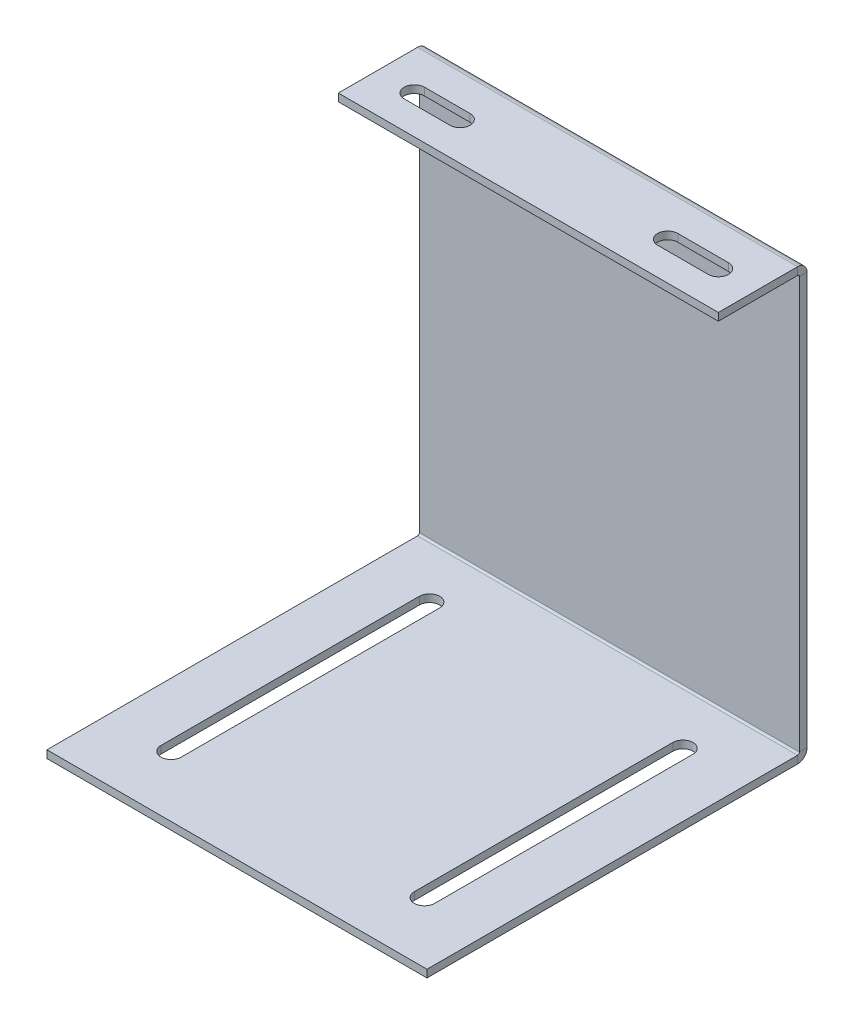
ISO-10303-21;
HEADER;
FILE_DESCRIPTION(('STEP AP214'),'2;1');
FILE_NAME('part.step','',(''),(''),'','','');
FILE_SCHEMA(('AUTOMOTIVE_DESIGN { 1 0 10303 214 1 1 1 1 }'));
ENDSEC;
DATA;
#1=APPLICATION_CONTEXT('core data for automotive mechanical design processes');
#2=APPLICATION_PROTOCOL_DEFINITION('international standard','automotive_design',2000,#1);
#3=PRODUCT_CONTEXT('',#1,'mechanical');
#4=PRODUCT('Part','Part','',(#3));
#5=PRODUCT_RELATED_PRODUCT_CATEGORY('part','',(#4));
#6=PRODUCT_DEFINITION_FORMATION('','',#4);
#7=PRODUCT_DEFINITION_CONTEXT('part definition',#1,'design');
#8=PRODUCT_DEFINITION('design','',#6,#7);
#9=PRODUCT_DEFINITION_SHAPE('','',#8);
#10=(LENGTH_UNIT() NAMED_UNIT(*) SI_UNIT(.MILLI.,.METRE.));
#11=(NAMED_UNIT(*) PLANE_ANGLE_UNIT() SI_UNIT($,.RADIAN.));
#12=(NAMED_UNIT(*) SI_UNIT($,.STERADIAN.) SOLID_ANGLE_UNIT());
#13=UNCERTAINTY_MEASURE_WITH_UNIT(LENGTH_MEASURE(1.E-05),#10,'distance_accuracy_value','');
#14=(GEOMETRIC_REPRESENTATION_CONTEXT(3) GLOBAL_UNCERTAINTY_ASSIGNED_CONTEXT((#13)) GLOBAL_UNIT_ASSIGNED_CONTEXT((#10,
#11,#12)) REPRESENTATION_CONTEXT('',''));
#15=CARTESIAN_POINT('',(0.,0.,0.));
#16=DIRECTION('',(0.,0.,1.));
#17=DIRECTION('',(1.,0.,0.));
#18=AXIS2_PLACEMENT_3D('',#15,#16,#17);
#19=CARTESIAN_POINT('',(-130.705035971223,0.,-28.9532374100719));
#20=DIRECTION('',(-1.,0.,0.));
#21=DIRECTION('',(0.,-1.,0.));
#22=AXIS2_PLACEMENT_3D('',#19,#20,#21);
#23=PLANE('',#22);
#24=DIRECTION('',(0.,1.,0.));
#25=VECTOR('',#24,1.);
#26=CARTESIAN_POINT('',(-130.705035971223,0.,-25.9532374100719));
#27=LINE('',#26,#25);
#28=CARTESIAN_POINT('',(-130.705035971223,163.2634,-25.9532374100719));
#29=VERTEX_POINT('',#28);
#30=CARTESIAN_POINT('',(-130.705035971223,0.736599999999999,-25.9532374100719));
#31=VERTEX_POINT('',#30);
#32=EDGE_CURVE('E373',#29,#31,#27,.F.);
#33=ORIENTED_EDGE('',*,*,#32,.F.);
#34=DIRECTION('',(0.,0.,-1.));
#35=VECTOR('',#34,1.);
#36=CARTESIAN_POINT('',(-130.705035971223,163.2634,-25.9532374100719));
#37=LINE('',#36,#35);
#38=CARTESIAN_POINT('',(-130.705035971223,163.2634,-28.9532374100719));
#39=VERTEX_POINT('',#38);
#40=EDGE_CURVE('E351',#29,#39,#37,.T.);
#41=ORIENTED_EDGE('',*,*,#40,.T.);
#42=DIRECTION('',(0.,-1.,0.));
#43=VECTOR('',#42,1.);
#44=CARTESIAN_POINT('',(-130.705035971223,0.,-28.9532374100719));
#45=LINE('',#44,#43);
#46=CARTESIAN_POINT('',(-130.705035971223,0.736600000000021,-28.9532374100719));
#47=VERTEX_POINT('',#46);
#48=EDGE_CURVE('E367',#39,#47,#45,.T.);
#49=ORIENTED_EDGE('',*,*,#48,.T.);
#50=DIRECTION('',(0.,0.,-1.));
#51=VECTOR('',#50,1.);
#52=CARTESIAN_POINT('',(-130.705035971223,0.7366,-25.9532374100719));
#53=LINE('',#52,#51);
#54=EDGE_CURVE('E381',#31,#47,#53,.T.);
#55=ORIENTED_EDGE('',*,*,#54,.F.);
#56=EDGE_LOOP('',(#33,#41,#49,#55));
#57=FACE_BOUND('',#56,.T.);
#58=ADVANCED_FACE('F78',(#57),#23,.T.);
#59=CARTESIAN_POINT('',(0.,0.,-28.9532374100719));
#60=DIRECTION('',(0.,0.,-1.));
#61=DIRECTION('',(-1.,0.,0.));
#62=AXIS2_PLACEMENT_3D('',#59,#60,#61);
#63=PLANE('',#62);
#64=ORIENTED_EDGE('',*,*,#48,.F.);
#65=DIRECTION('',(-1.,0.,0.));
#66=VECTOR('',#65,1.);
#67=CARTESIAN_POINT('',(-130.705035971223,163.2634,-28.9532374100719));
#68=LINE('',#67,#66);
#69=CARTESIAN_POINT('',(19.2949640287769,163.2634,-28.9532374100719));
#70=VERTEX_POINT('',#69);
#71=EDGE_CURVE('E344',#39,#70,#68,.F.);
#72=ORIENTED_EDGE('',*,*,#71,.T.);
#73=DIRECTION('',(0.,1.,0.));
#74=VECTOR('',#73,1.);
#75=CARTESIAN_POINT('',(19.2949640287769,167.,-28.9532374100719));
#76=LINE('',#75,#74);
#77=CARTESIAN_POINT('',(19.2949640287769,0.736599999999988,-28.9532374100719));
#78=VERTEX_POINT('',#77);
#79=EDGE_CURVE('E370',#78,#70,#76,.T.);
#80=ORIENTED_EDGE('',*,*,#79,.F.);
#81=DIRECTION('',(-1.,0.,0.));
#82=VECTOR('',#81,1.);
#83=CARTESIAN_POINT('',(0.,0.736600000000018,-28.9532374100719));
#84=LINE('',#83,#82);
#85=EDGE_CURVE('E378',#78,#47,#84,.T.);
#86=ORIENTED_EDGE('',*,*,#85,.T.);
#87=EDGE_LOOP('',(#64,#72,#80,#86));
#88=FACE_BOUND('',#87,.T.);
#89=ADVANCED_FACE('F532',(#88),#63,.T.);
#90=CARTESIAN_POINT('',(0.,0.,-25.9532374100719));
#91=DIRECTION('',(0.,0.,-1.));
#92=DIRECTION('',(-1.,0.,0.));
#93=AXIS2_PLACEMENT_3D('',#90,#91,#92);
#94=PLANE('',#93);
#95=DIRECTION('',(-1.,0.,0.));
#96=VECTOR('',#95,1.);
#97=CARTESIAN_POINT('',(-130.705035971223,163.2634,-25.9532374100719));
#98=LINE('',#97,#96);
#99=CARTESIAN_POINT('',(19.2949640287769,163.2634,-25.9532374100719));
#100=VERTEX_POINT('',#99);
#101=EDGE_CURVE('E357',#29,#100,#98,.F.);
#102=ORIENTED_EDGE('',*,*,#101,.F.);
#103=ORIENTED_EDGE('',*,*,#32,.T.);
#104=DIRECTION('',(1.,0.,0.));
#105=VECTOR('',#104,1.);
#106=CARTESIAN_POINT('',(19.2949640287769,0.736599999999997,-25.9532374100719));
#107=LINE('',#106,#105);
#108=CARTESIAN_POINT('',(19.2949640287769,0.736599999999988,-25.9532374100719));
#109=VERTEX_POINT('',#108);
#110=EDGE_CURVE('E384',#109,#31,#107,.F.);
#111=ORIENTED_EDGE('',*,*,#110,.F.);
#112=DIRECTION('',(0.,-1.,0.));
#113=VECTOR('',#112,1.);
#114=CARTESIAN_POINT('',(19.2949640287769,0.,-25.9532374100719));
#115=LINE('',#114,#113);
#116=EDGE_CURVE('E375',#109,#100,#115,.F.);
#117=ORIENTED_EDGE('',*,*,#116,.T.);
#118=EDGE_LOOP('',(#102,#103,#111,#117));
#119=FACE_BOUND('',#118,.T.);
#120=ADVANCED_FACE('F538',(#119),#94,.F.);
#121=CARTESIAN_POINT('',(-130.705035971223,-3.,-28.9532374100719));
#122=DIRECTION('',(-1.,0.,0.));
#123=DIRECTION('',(0.,0.,1.));
#124=AXIS2_PLACEMENT_3D('',#121,#122,#123);
#125=PLANE('',#124);
#126=DIRECTION('',(0.,0.,1.));
#127=VECTOR('',#126,1.);
#128=CARTESIAN_POINT('',(-130.705035971223,0.,-28.9532374100719));
#129=LINE('',#128,#127);
#130=CARTESIAN_POINT('',(-130.705035971223,0.,-25.2166374100719));
#131=VERTEX_POINT('',#130);
#132=CARTESIAN_POINT('',(-130.705035971223,0.,121.046762589928));
#133=VERTEX_POINT('',#132);
#134=EDGE_CURVE('E488',#131,#133,#129,.T.);
#135=ORIENTED_EDGE('',*,*,#134,.F.);
#136=DIRECTION('',(0.,-1.,0.));
#137=VECTOR('',#136,1.);
#138=CARTESIAN_POINT('',(-130.705035971223,0.,-25.2166374100719));
#139=LINE('',#138,#137);
#140=CARTESIAN_POINT('',(-130.705035971223,-3.,-25.2166374100719));
#141=VERTEX_POINT('',#140);
#142=EDGE_CURVE('E396',#131,#141,#139,.T.);
#143=ORIENTED_EDGE('',*,*,#142,.T.);
#144=DIRECTION('',(0.,0.,1.));
#145=VECTOR('',#144,1.);
#146=CARTESIAN_POINT('',(-130.705035971223,-3.,-28.9532374100719));
#147=LINE('',#146,#145);
#148=CARTESIAN_POINT('',(-130.705035971223,-3.,121.046762589928));
#149=VERTEX_POINT('',#148);
#150=EDGE_CURVE('E479',#141,#149,#147,.T.);
#151=ORIENTED_EDGE('',*,*,#150,.T.);
#152=DIRECTION('',(0.,1.,0.));
#153=VECTOR('',#152,1.);
#154=CARTESIAN_POINT('',(-130.705035971223,-3.,121.046762589928));
#155=LINE('',#154,#153);
#156=EDGE_CURVE('E485',#149,#133,#155,.T.);
#157=ORIENTED_EDGE('',*,*,#156,.T.);
#158=EDGE_LOOP('',(#135,#143,#151,#157));
#159=FACE_BOUND('',#158,.T.);
#160=ADVANCED_FACE('F602',(#159),#125,.T.);
#161=CARTESIAN_POINT('',(0.,-3.,0.));
#162=DIRECTION('',(0.,-1.,0.));
#163=DIRECTION('',(0.,0.,-1.));
#164=AXIS2_PLACEMENT_3D('',#161,#162,#163);
#165=PLANE('',#164);
#166=CARTESIAN_POINT('',(-5.70503597122307,-3.,-4.95323741007185));
#167=DIRECTION('',(0.,1.,0.));
#168=DIRECTION('',(0.,0.,1.));
#169=AXIS2_PLACEMENT_3D('',#166,#167,#168);
#170=CIRCLE('',#169,4.);
#171=CARTESIAN_POINT('',(-1.70503597122307,-3.,-4.95323741007185));
#172=VERTEX_POINT('',#171);
#173=CARTESIAN_POINT('',(-9.70503597122308,-3.,-4.95323741007185));
#174=VERTEX_POINT('',#173);
#175=EDGE_CURVE('E412',#172,#174,#170,.T.);
#176=ORIENTED_EDGE('',*,*,#175,.T.);
#177=DIRECTION('',(0.,0.,1.));
#178=VECTOR('',#177,1.);
#179=CARTESIAN_POINT('',(-9.70503597122308,-3.,-4.95323741007185));
#180=LINE('',#179,#178);
#181=CARTESIAN_POINT('',(-9.70503597122306,-3.,97.0467625899281));
#182=VERTEX_POINT('',#181);
#183=EDGE_CURVE('E415',#174,#182,#180,.T.);
#184=ORIENTED_EDGE('',*,*,#183,.T.);
#185=CARTESIAN_POINT('',(-5.70503597122306,-3.,97.0467625899281));
#186=DIRECTION('',(0.,1.,0.));
#187=DIRECTION('',(0.,0.,1.));
#188=AXIS2_PLACEMENT_3D('',#185,#186,#187);
#189=CIRCLE('',#188,4.);
#190=CARTESIAN_POINT('',(-1.70503597122305,-3.,97.0467625899281));
#191=VERTEX_POINT('',#190);
#192=EDGE_CURVE('E419',#182,#191,#189,.T.);
#193=ORIENTED_EDGE('',*,*,#192,.T.);
#194=DIRECTION('',(0.,0.,-1.));
#195=VECTOR('',#194,1.);
#196=CARTESIAN_POINT('',(-1.70503597122307,-3.,-4.95323741007185));
#197=LINE('',#196,#195);
#198=EDGE_CURVE('E422',#191,#172,#197,.T.);
#199=ORIENTED_EDGE('',*,*,#198,.T.);
#200=EDGE_LOOP('',(#176,#184,#193,#199));
#201=FACE_BOUND('',#200,.T.);
#202=CARTESIAN_POINT('',(-105.705035971223,-3.,-4.95323741007191));
#203=DIRECTION('',(0.,1.,0.));
#204=DIRECTION('',(0.,0.,1.));
#205=AXIS2_PLACEMENT_3D('',#202,#203,#204);
#206=CIRCLE('',#205,4.);
#207=CARTESIAN_POINT('',(-101.705035971223,-3.,-4.95323741007191));
#208=VERTEX_POINT('',#207);
#209=CARTESIAN_POINT('',(-109.705035971223,-3.,-4.95323741007191));
#210=VERTEX_POINT('',#209);
#211=EDGE_CURVE('E444',#208,#210,#206,.T.);
#212=ORIENTED_EDGE('',*,*,#211,.T.);
#213=DIRECTION('',(0.,0.,1.));
#214=VECTOR('',#213,1.);
#215=CARTESIAN_POINT('',(-109.705035971223,-3.,-4.95323741007191));
#216=LINE('',#215,#214);
#217=CARTESIAN_POINT('',(-109.705035971223,-3.,97.0467625899281));
#218=VERTEX_POINT('',#217);
#219=EDGE_CURVE('E447',#210,#218,#216,.T.);
#220=ORIENTED_EDGE('',*,*,#219,.T.);
#221=CARTESIAN_POINT('',(-105.705035971223,-3.,97.0467625899281));
#222=DIRECTION('',(0.,1.,0.));
#223=DIRECTION('',(0.,0.,1.));
#224=AXIS2_PLACEMENT_3D('',#221,#222,#223);
#225=CIRCLE('',#224,4.00000000000002);
#226=CARTESIAN_POINT('',(-101.705035971223,-3.,97.0467625899281));
#227=VERTEX_POINT('',#226);
#228=EDGE_CURVE('E451',#218,#227,#225,.T.);
#229=ORIENTED_EDGE('',*,*,#228,.T.);
#230=DIRECTION('',(0.,0.,-1.));
#231=VECTOR('',#230,1.);
#232=CARTESIAN_POINT('',(-101.705035971223,-3.,-4.95323741007191));
#233=LINE('',#232,#231);
#234=EDGE_CURVE('E454',#227,#208,#233,.T.);
#235=ORIENTED_EDGE('',*,*,#234,.T.);
#236=EDGE_LOOP('',(#212,#220,#229,#235));
#237=FACE_BOUND('',#236,.T.);
#238=ORIENTED_EDGE('',*,*,#150,.F.);
#239=DIRECTION('',(-1.,0.,0.));
#240=VECTOR('',#239,1.);
#241=CARTESIAN_POINT('',(-130.705035971223,-3.,-25.2166374100719));
#242=LINE('',#241,#240);
#243=CARTESIAN_POINT('',(19.2949640287769,-3.,-25.2166374100719));
#244=VERTEX_POINT('',#243);
#245=EDGE_CURVE('E389',#141,#244,#242,.F.);
#246=ORIENTED_EDGE('',*,*,#245,.T.);
#247=DIRECTION('',(0.,0.,-1.));
#248=VECTOR('',#247,1.);
#249=CARTESIAN_POINT('',(19.2949640287769,-3.,-28.9532374100719));
#250=LINE('',#249,#248);
#251=CARTESIAN_POINT('',(19.2949640287769,-3.,121.046762589928));
#252=VERTEX_POINT('',#251);
#253=EDGE_CURVE('E476',#252,#244,#250,.T.);
#254=ORIENTED_EDGE('',*,*,#253,.F.);
#255=DIRECTION('',(1.,0.,0.));
#256=VECTOR('',#255,1.);
#257=CARTESIAN_POINT('',(19.2949640287769,-3.,121.046762589928));
#258=LINE('',#257,#256);
#259=EDGE_CURVE('E482',#149,#252,#258,.T.);
#260=ORIENTED_EDGE('',*,*,#259,.F.);
#261=EDGE_LOOP('',(#238,#246,#254,#260));
#262=FACE_BOUND('',#261,.T.);
#263=ADVANCED_FACE('F598',(#201,#237,#262),#165,.T.);
#264=CARTESIAN_POINT('',(0.,0.,0.));
#265=DIRECTION('',(0.,-1.,0.));
#266=DIRECTION('',(0.,0.,-1.));
#267=AXIS2_PLACEMENT_3D('',#264,#265,#266);
#268=PLANE('',#267);
#269=DIRECTION('',(0.,0.,1.));
#270=VECTOR('',#269,1.);
#271=CARTESIAN_POINT('',(-109.705035971223,0.,-4.95323741007191));
#272=LINE('',#271,#270);
#273=CARTESIAN_POINT('',(-109.705035971223,0.,-4.95323741007191));
#274=VERTEX_POINT('',#273);
#275=CARTESIAN_POINT('',(-109.705035971223,0.,97.0467625899281));
#276=VERTEX_POINT('',#275);
#277=EDGE_CURVE('E459',#274,#276,#272,.T.);
#278=ORIENTED_EDGE('',*,*,#277,.F.);
#279=CARTESIAN_POINT('',(-105.705035971223,0.,-4.95323741007191));
#280=DIRECTION('',(0.,1.,0.));
#281=DIRECTION('',(0.,0.,1.));
#282=AXIS2_PLACEMENT_3D('',#279,#280,#281);
#283=CIRCLE('',#282,4.);
#284=CARTESIAN_POINT('',(-101.705035971223,0.,-4.95323741007191));
#285=VERTEX_POINT('',#284);
#286=EDGE_CURVE('E437',#285,#274,#283,.T.);
#287=ORIENTED_EDGE('',*,*,#286,.F.);
#288=DIRECTION('',(0.,0.,-1.));
#289=VECTOR('',#288,1.);
#290=CARTESIAN_POINT('',(-101.705035971223,0.,-4.95323741007191));
#291=LINE('',#290,#289);
#292=CARTESIAN_POINT('',(-101.705035971223,0.,97.0467625899281));
#293=VERTEX_POINT('',#292);
#294=EDGE_CURVE('E448',#293,#285,#291,.T.);
#295=ORIENTED_EDGE('',*,*,#294,.F.);
#296=CARTESIAN_POINT('',(-105.705035971223,0.,97.0467625899281));
#297=DIRECTION('',(0.,1.,0.));
#298=DIRECTION('',(0.,0.,1.));
#299=AXIS2_PLACEMENT_3D('',#296,#297,#298);
#300=CIRCLE('',#299,4.00000000000002);
#301=EDGE_CURVE('E462',#276,#293,#300,.T.);
#302=ORIENTED_EDGE('',*,*,#301,.F.);
#303=EDGE_LOOP('',(#278,#287,#295,#302));
#304=FACE_BOUND('',#303,.T.);
#305=DIRECTION('',(0.,0.,1.));
#306=VECTOR('',#305,1.);
#307=CARTESIAN_POINT('',(-9.70503597122308,0.,-4.95323741007185));
#308=LINE('',#307,#306);
#309=CARTESIAN_POINT('',(-9.70503597122308,0.,-4.95323741007185));
#310=VERTEX_POINT('',#309);
#311=CARTESIAN_POINT('',(-9.70503597122306,0.,97.0467625899281));
#312=VERTEX_POINT('',#311);
#313=EDGE_CURVE('E427',#310,#312,#308,.T.);
#314=ORIENTED_EDGE('',*,*,#313,.F.);
#315=CARTESIAN_POINT('',(-5.70503597122307,0.,-4.95323741007185));
#316=DIRECTION('',(0.,1.,0.));
#317=DIRECTION('',(0.,0.,1.));
#318=AXIS2_PLACEMENT_3D('',#315,#316,#317);
#319=CIRCLE('',#318,4.);
#320=CARTESIAN_POINT('',(-1.70503597122307,0.,-4.95323741007185));
#321=VERTEX_POINT('',#320);
#322=EDGE_CURVE('E409',#321,#310,#319,.T.);
#323=ORIENTED_EDGE('',*,*,#322,.F.);
#324=DIRECTION('',(0.,0.,-1.));
#325=VECTOR('',#324,1.);
#326=CARTESIAN_POINT('',(-1.70503597122307,0.,-4.95323741007185));
#327=LINE('',#326,#325);
#328=CARTESIAN_POINT('',(-1.70503597122305,0.,97.0467625899281));
#329=VERTEX_POINT('',#328);
#330=EDGE_CURVE('E416',#329,#321,#327,.T.);
#331=ORIENTED_EDGE('',*,*,#330,.F.);
#332=CARTESIAN_POINT('',(-5.70503597122306,0.,97.0467625899281));
#333=DIRECTION('',(0.,1.,0.));
#334=DIRECTION('',(0.,0.,1.));
#335=AXIS2_PLACEMENT_3D('',#332,#333,#334);
#336=CIRCLE('',#335,4.);
#337=EDGE_CURVE('E430',#312,#329,#336,.T.);
#338=ORIENTED_EDGE('',*,*,#337,.F.);
#339=EDGE_LOOP('',(#314,#323,#331,#338));
#340=FACE_BOUND('',#339,.T.);
#341=DIRECTION('',(-1.,0.,0.));
#342=VECTOR('',#341,1.);
#343=CARTESIAN_POINT('',(-130.705035971223,0.,-25.2166374100719));
#344=LINE('',#343,#342);
#345=CARTESIAN_POINT('',(19.2949640287769,0.,-25.2166374100719));
#346=VERTEX_POINT('',#345);
#347=EDGE_CURVE('E402',#131,#346,#344,.F.);
#348=ORIENTED_EDGE('',*,*,#347,.F.);
#349=ORIENTED_EDGE('',*,*,#134,.T.);
#350=DIRECTION('',(1.,0.,0.));
#351=VECTOR('',#350,1.);
#352=CARTESIAN_POINT('',(19.2949640287769,0.,121.046762589928));
#353=LINE('',#352,#351);
#354=CARTESIAN_POINT('',(19.2949640287769,0.,121.046762589928));
#355=VERTEX_POINT('',#354);
#356=EDGE_CURVE('E480',#133,#355,#353,.T.);
#357=ORIENTED_EDGE('',*,*,#356,.T.);
#358=DIRECTION('',(0.,0.,-1.));
#359=VECTOR('',#358,1.);
#360=CARTESIAN_POINT('',(19.2949640287769,0.,-28.9532374100719));
#361=LINE('',#360,#359);
#362=EDGE_CURVE('E469',#355,#346,#361,.T.);
#363=ORIENTED_EDGE('',*,*,#362,.T.);
#364=EDGE_LOOP('',(#348,#349,#357,#363));
#365=FACE_BOUND('',#364,.T.);
#366=ADVANCED_FACE('F601',(#304,#340,#365),#268,.F.);
#367=CARTESIAN_POINT('',(19.2949640287769,-3.,-28.9532374100719));
#368=DIRECTION('',(1.,0.,0.));
#369=DIRECTION('',(0.,0.,-1.));
#370=AXIS2_PLACEMENT_3D('',#367,#368,#369);
#371=PLANE('',#370);
#372=DIRECTION('',(0.,-1.,0.));
#373=VECTOR('',#372,1.);
#374=CARTESIAN_POINT('',(19.2949640287769,0.,-25.2166374100719));
#375=LINE('',#374,#373);
#376=EDGE_CURVE('E406',#346,#244,#375,.T.);
#377=ORIENTED_EDGE('',*,*,#376,.F.);
#378=ORIENTED_EDGE('',*,*,#362,.F.);
#379=DIRECTION('',(0.,1.,0.));
#380=VECTOR('',#379,1.);
#381=CARTESIAN_POINT('',(19.2949640287769,-3.,121.046762589928));
#382=LINE('',#381,#380);
#383=EDGE_CURVE('E492',#252,#355,#382,.T.);
#384=ORIENTED_EDGE('',*,*,#383,.F.);
#385=ORIENTED_EDGE('',*,*,#253,.T.);
#386=EDGE_LOOP('',(#377,#378,#384,#385));
#387=FACE_BOUND('',#386,.T.);
#388=ADVANCED_FACE('F80',(#387),#371,.T.);
#389=CARTESIAN_POINT('',(19.2949640287769,-3.,121.046762589928));
#390=DIRECTION('',(0.,0.,1.));
#391=DIRECTION('',(1.,0.,0.));
#392=AXIS2_PLACEMENT_3D('',#389,#390,#391);
#393=PLANE('',#392);
#394=ORIENTED_EDGE('',*,*,#356,.F.);
#395=ORIENTED_EDGE('',*,*,#156,.F.);
#396=ORIENTED_EDGE('',*,*,#259,.T.);
#397=ORIENTED_EDGE('',*,*,#383,.T.);
#398=EDGE_LOOP('',(#394,#395,#396,#397));
#399=FACE_BOUND('',#398,.T.);
#400=ADVANCED_FACE('F596',(#399),#393,.T.);
#401=CARTESIAN_POINT('',(-105.705035971223,-3.,-4.95323741007191));
#402=DIRECTION('',(0.,1.,0.));
#403=DIRECTION('',(0.,0.,1.));
#404=AXIS2_PLACEMENT_3D('',#401,#402,#403);
#405=CYLINDRICAL_SURFACE('',#404,4.);
#406=ORIENTED_EDGE('',*,*,#286,.T.);
#407=DIRECTION('',(0.,1.,0.));
#408=VECTOR('',#407,1.);
#409=CARTESIAN_POINT('',(-109.705035971223,-3.,-4.95323741007191));
#410=LINE('',#409,#408);
#411=EDGE_CURVE('E457',#210,#274,#410,.T.);
#412=ORIENTED_EDGE('',*,*,#411,.F.);
#413=ORIENTED_EDGE('',*,*,#211,.F.);
#414=DIRECTION('',(0.,1.,0.));
#415=VECTOR('',#414,1.);
#416=CARTESIAN_POINT('',(-101.705035971223,-3.,-4.95323741007191));
#417=LINE('',#416,#415);
#418=EDGE_CURVE('E467',#208,#285,#417,.T.);
#419=ORIENTED_EDGE('',*,*,#418,.T.);
#420=EDGE_LOOP('',(#406,#412,#413,#419));
#421=FACE_BOUND('',#420,.T.);
#422=ADVANCED_FACE('F586',(#421),#405,.F.);
#423=CARTESIAN_POINT('',(-101.705035971223,-3.,-4.95323741007191));
#424=DIRECTION('',(1.,0.,0.));
#425=DIRECTION('',(0.,0.,-1.));
#426=AXIS2_PLACEMENT_3D('',#423,#424,#425);
#427=PLANE('',#426);
#428=ORIENTED_EDGE('',*,*,#294,.T.);
#429=ORIENTED_EDGE('',*,*,#418,.F.);
#430=ORIENTED_EDGE('',*,*,#234,.F.);
#431=DIRECTION('',(0.,1.,0.));
#432=VECTOR('',#431,1.);
#433=CARTESIAN_POINT('',(-101.705035971223,-3.,97.0467625899281));
#434=LINE('',#433,#432);
#435=EDGE_CURVE('E470',#227,#293,#434,.T.);
#436=ORIENTED_EDGE('',*,*,#435,.T.);
#437=EDGE_LOOP('',(#428,#429,#430,#436));
#438=FACE_BOUND('',#437,.T.);
#439=ADVANCED_FACE('F582',(#438),#427,.F.);
#440=CARTESIAN_POINT('',(-105.705035971223,-3.,97.0467625899281));
#441=DIRECTION('',(0.,1.,0.));
#442=DIRECTION('',(0.,0.,1.));
#443=AXIS2_PLACEMENT_3D('',#440,#441,#442);
#444=CYLINDRICAL_SURFACE('',#443,4.00000000000002);
#445=ORIENTED_EDGE('',*,*,#301,.T.);
#446=ORIENTED_EDGE('',*,*,#435,.F.);
#447=ORIENTED_EDGE('',*,*,#228,.F.);
#448=DIRECTION('',(0.,1.,0.));
#449=VECTOR('',#448,1.);
#450=CARTESIAN_POINT('',(-109.705035971223,-3.,97.0467625899281));
#451=LINE('',#450,#449);
#452=EDGE_CURVE('E472',#218,#276,#451,.T.);
#453=ORIENTED_EDGE('',*,*,#452,.T.);
#454=EDGE_LOOP('',(#445,#446,#447,#453));
#455=FACE_BOUND('',#454,.T.);
#456=ADVANCED_FACE('F585',(#455),#444,.F.);
#457=CARTESIAN_POINT('',(-109.705035971223,-3.,-4.95323741007191));
#458=DIRECTION('',(-1.,0.,0.));
#459=DIRECTION('',(0.,0.,1.));
#460=AXIS2_PLACEMENT_3D('',#457,#458,#459);
#461=PLANE('',#460);
#462=ORIENTED_EDGE('',*,*,#277,.T.);
#463=ORIENTED_EDGE('',*,*,#452,.F.);
#464=ORIENTED_EDGE('',*,*,#219,.F.);
#465=ORIENTED_EDGE('',*,*,#411,.T.);
#466=EDGE_LOOP('',(#462,#463,#464,#465));
#467=FACE_BOUND('',#466,.T.);
#468=ADVANCED_FACE('F580',(#467),#461,.F.);
#469=CARTESIAN_POINT('',(-5.70503597122307,-3.,-4.95323741007185));
#470=DIRECTION('',(0.,1.,0.));
#471=DIRECTION('',(0.,0.,1.));
#472=AXIS2_PLACEMENT_3D('',#469,#470,#471);
#473=CYLINDRICAL_SURFACE('',#472,4.);
#474=ORIENTED_EDGE('',*,*,#322,.T.);
#475=DIRECTION('',(0.,1.,0.));
#476=VECTOR('',#475,1.);
#477=CARTESIAN_POINT('',(-9.70503597122308,-3.,-4.95323741007185));
#478=LINE('',#477,#476);
#479=EDGE_CURVE('E425',#174,#310,#478,.T.);
#480=ORIENTED_EDGE('',*,*,#479,.F.);
#481=ORIENTED_EDGE('',*,*,#175,.F.);
#482=DIRECTION('',(0.,1.,0.));
#483=VECTOR('',#482,1.);
#484=CARTESIAN_POINT('',(-1.70503597122307,-3.,-4.95323741007185));
#485=LINE('',#484,#483);
#486=EDGE_CURVE('E435',#172,#321,#485,.T.);
#487=ORIENTED_EDGE('',*,*,#486,.T.);
#488=EDGE_LOOP('',(#474,#480,#481,#487));
#489=FACE_BOUND('',#488,.T.);
#490=ADVANCED_FACE('F570',(#489),#473,.F.);
#491=CARTESIAN_POINT('',(-1.70503597122307,-3.,-4.95323741007185));
#492=DIRECTION('',(1.,0.,0.));
#493=DIRECTION('',(0.,0.,-1.));
#494=AXIS2_PLACEMENT_3D('',#491,#492,#493);
#495=PLANE('',#494);
#496=ORIENTED_EDGE('',*,*,#330,.T.);
#497=ORIENTED_EDGE('',*,*,#486,.F.);
#498=ORIENTED_EDGE('',*,*,#198,.F.);
#499=DIRECTION('',(0.,1.,0.));
#500=VECTOR('',#499,1.);
#501=CARTESIAN_POINT('',(-1.70503597122305,-3.,97.0467625899281));
#502=LINE('',#501,#500);
#503=EDGE_CURVE('E438',#191,#329,#502,.T.);
#504=ORIENTED_EDGE('',*,*,#503,.T.);
#505=EDGE_LOOP('',(#496,#497,#498,#504));
#506=FACE_BOUND('',#505,.T.);
#507=ADVANCED_FACE('F566',(#506),#495,.F.);
#508=CARTESIAN_POINT('',(-5.70503597122306,-3.,97.0467625899281));
#509=DIRECTION('',(0.,1.,0.));
#510=DIRECTION('',(0.,0.,1.));
#511=AXIS2_PLACEMENT_3D('',#508,#509,#510);
#512=CYLINDRICAL_SURFACE('',#511,4.);
#513=ORIENTED_EDGE('',*,*,#337,.T.);
#514=ORIENTED_EDGE('',*,*,#503,.F.);
#515=ORIENTED_EDGE('',*,*,#192,.F.);
#516=DIRECTION('',(0.,1.,0.));
#517=VECTOR('',#516,1.);
#518=CARTESIAN_POINT('',(-9.70503597122306,-3.,97.0467625899281));
#519=LINE('',#518,#517);
#520=EDGE_CURVE('E440',#182,#312,#519,.T.);
#521=ORIENTED_EDGE('',*,*,#520,.T.);
#522=EDGE_LOOP('',(#513,#514,#515,#521));
#523=FACE_BOUND('',#522,.T.);
#524=ADVANCED_FACE('F569',(#523),#512,.F.);
#525=CARTESIAN_POINT('',(-9.70503597122308,-3.,-4.95323741007185));
#526=DIRECTION('',(-1.,0.,0.));
#527=DIRECTION('',(0.,0.,1.));
#528=AXIS2_PLACEMENT_3D('',#525,#526,#527);
#529=PLANE('',#528);
#530=ORIENTED_EDGE('',*,*,#313,.T.);
#531=ORIENTED_EDGE('',*,*,#520,.F.);
#532=ORIENTED_EDGE('',*,*,#183,.F.);
#533=ORIENTED_EDGE('',*,*,#479,.T.);
#534=EDGE_LOOP('',(#530,#531,#532,#533));
#535=FACE_BOUND('',#534,.T.);
#536=ADVANCED_FACE('F561',(#535),#529,.F.);
#537=CARTESIAN_POINT('',(19.2949640287769,0.736599999999988,-25.2166374100719));
#538=DIRECTION('',(1.,0.,0.));
#539=DIRECTION('',(0.,1.,0.));
#540=AXIS2_PLACEMENT_3D('',#537,#538,#539);
#541=PLANE('',#540);
#542=DIRECTION('',(0.,0.,-1.));
#543=VECTOR('',#542,1.);
#544=CARTESIAN_POINT('',(19.2949640287769,0.736600000000032,-28.9532374100731));
#545=LINE('',#544,#543);
#546=EDGE_CURVE('E364',#109,#78,#545,.T.);
#547=ORIENTED_EDGE('',*,*,#546,.F.);
#548=CARTESIAN_POINT('',(19.2949640287769,0.736599999999988,-25.2166374100719));
#549=DIRECTION('',(-1.,0.,0.));
#550=DIRECTION('',(0.,-1.,0.));
#551=AXIS2_PLACEMENT_3D('',#548,#549,#550);
#552=CIRCLE('',#551,0.7366);
#553=EDGE_CURVE('E399',#346,#109,#552,.F.);
#554=ORIENTED_EDGE('',*,*,#553,.F.);
#555=ORIENTED_EDGE('',*,*,#376,.T.);
#556=CARTESIAN_POINT('',(19.2949640287769,0.736599999999988,-25.2166374100719));
#557=DIRECTION('',(-1.,0.,0.));
#558=DIRECTION('',(0.,-1.,0.));
#559=AXIS2_PLACEMENT_3D('',#556,#557,#558);
#560=CIRCLE('',#559,3.7366);
#561=EDGE_CURVE('E392',#244,#78,#560,.F.);
#562=ORIENTED_EDGE('',*,*,#561,.T.);
#563=EDGE_LOOP('',(#547,#554,#555,#562));
#564=FACE_BOUND('',#563,.T.);
#565=ADVANCED_FACE('F558',(#564),#541,.T.);
#566=CARTESIAN_POINT('',(-130.705035971223,0.736599999999999,-25.2166374100719));
#567=DIRECTION('',(1.,0.,0.));
#568=DIRECTION('',(0.,1.,0.));
#569=AXIS2_PLACEMENT_3D('',#566,#567,#568);
#570=PLANE('',#569);
#571=CARTESIAN_POINT('',(-130.705035971223,0.736599999999999,-25.2166374100719));
#572=DIRECTION('',(-1.,0.,0.));
#573=DIRECTION('',(0.,-1.,0.));
#574=AXIS2_PLACEMENT_3D('',#571,#572,#573);
#575=CIRCLE('',#574,0.7366);
#576=EDGE_CURVE('E369',#31,#131,#575,.T.);
#577=ORIENTED_EDGE('',*,*,#576,.F.);
#578=ORIENTED_EDGE('',*,*,#54,.T.);
#579=CARTESIAN_POINT('',(-130.705035971223,0.736599999999999,-25.2166374100719));
#580=DIRECTION('',(-1.,0.,0.));
#581=DIRECTION('',(0.,-1.,0.));
#582=AXIS2_PLACEMENT_3D('',#579,#580,#581);
#583=CIRCLE('',#582,3.7366);
#584=EDGE_CURVE('E393',#47,#141,#583,.T.);
#585=ORIENTED_EDGE('',*,*,#584,.T.);
#586=ORIENTED_EDGE('',*,*,#142,.F.);
#587=EDGE_LOOP('',(#577,#578,#585,#586));
#588=FACE_BOUND('',#587,.T.);
#589=ADVANCED_FACE('F553',(#588),#570,.F.);
#590=CARTESIAN_POINT('',(-130.705035971223,0.736599999999999,-25.2166374100719));
#591=DIRECTION('',(-1.,0.,0.));
#592=DIRECTION('',(0.,0.,-1.));
#593=AXIS2_PLACEMENT_3D('',#590,#591,#592);
#594=CYLINDRICAL_SURFACE('',#593,3.7366);
#595=ORIENTED_EDGE('',*,*,#245,.F.);
#596=ORIENTED_EDGE('',*,*,#584,.F.);
#597=ORIENTED_EDGE('',*,*,#85,.F.);
#598=ORIENTED_EDGE('',*,*,#561,.F.);
#599=EDGE_LOOP('',(#595,#596,#597,#598));
#600=FACE_BOUND('',#599,.T.);
#601=ADVANCED_FACE('F550',(#600),#594,.T.);
#602=CARTESIAN_POINT('',(-130.705035971223,0.736599999999999,-25.2166374100719));
#603=DIRECTION('',(-1.,0.,0.));
#604=DIRECTION('',(0.,0.,-1.));
#605=AXIS2_PLACEMENT_3D('',#602,#603,#604);
#606=CYLINDRICAL_SURFACE('',#605,0.7366);
#607=ORIENTED_EDGE('',*,*,#347,.T.);
#608=ORIENTED_EDGE('',*,*,#553,.T.);
#609=ORIENTED_EDGE('',*,*,#110,.T.);
#610=ORIENTED_EDGE('',*,*,#576,.T.);
#611=EDGE_LOOP('',(#607,#608,#609,#610));
#612=FACE_BOUND('',#611,.T.);
#613=ADVANCED_FACE('F548',(#612),#606,.F.);
#614=CARTESIAN_POINT('',(19.2949640287769,167.,-28.9532374100719));
#615=DIRECTION('',(1.,0.,0.));
#616=DIRECTION('',(0.,1.,0.));
#617=AXIS2_PLACEMENT_3D('',#614,#615,#616);
#618=PLANE('',#617);
#619=DIRECTION('',(0.,0.,-1.));
#620=VECTOR('',#619,1.);
#621=CARTESIAN_POINT('',(19.2949640287769,163.2634,-25.9532374100719));
#622=LINE('',#621,#620);
#623=EDGE_CURVE('E361',#100,#70,#622,.T.);
#624=ORIENTED_EDGE('',*,*,#623,.F.);
#625=ORIENTED_EDGE('',*,*,#116,.F.);
#626=ORIENTED_EDGE('',*,*,#546,.T.);
#627=ORIENTED_EDGE('',*,*,#79,.T.);
#628=EDGE_LOOP('',(#624,#625,#626,#627));
#629=FACE_BOUND('',#628,.T.);
#630=ADVANCED_FACE('F544',(#629),#618,.T.);
#631=CARTESIAN_POINT('',(19.2949640287769,163.2634,-25.2166374100719));
#632=DIRECTION('',(1.,0.,0.));
#633=DIRECTION('',(0.,0.,-1.));
#634=AXIS2_PLACEMENT_3D('',#631,#632,#633);
#635=PLANE('',#634);
#636=DIRECTION('',(0.,1.,0.));
#637=VECTOR('',#636,1.);
#638=CARTESIAN_POINT('',(19.2949640287769,167.,-25.2166374100719));
#639=LINE('',#638,#637);
#640=CARTESIAN_POINT('',(19.2949640287769,164.,-25.2166374100719));
#641=VERTEX_POINT('',#640);
#642=CARTESIAN_POINT('',(19.2949640287769,167.,-25.2166374100719));
#643=VERTEX_POINT('',#642);
#644=EDGE_CURVE('E305',#641,#643,#639,.T.);
#645=ORIENTED_EDGE('',*,*,#644,.F.);
#646=CARTESIAN_POINT('',(19.2949640287769,163.2634,-25.2166374100719));
#647=DIRECTION('',(-1.,0.,0.));
#648=DIRECTION('',(0.,0.,1.));
#649=AXIS2_PLACEMENT_3D('',#646,#647,#648);
#650=CIRCLE('',#649,0.736600000000004);
#651=EDGE_CURVE('E354',#100,#641,#650,.F.);
#652=ORIENTED_EDGE('',*,*,#651,.F.);
#653=ORIENTED_EDGE('',*,*,#623,.T.);
#654=CARTESIAN_POINT('',(19.2949640287769,163.2634,-25.2166374100719));
#655=DIRECTION('',(-1.,0.,0.));
#656=DIRECTION('',(0.,0.,1.));
#657=AXIS2_PLACEMENT_3D('',#654,#655,#656);
#658=CIRCLE('',#657,3.7366);
#659=EDGE_CURVE('E347',#70,#643,#658,.F.);
#660=ORIENTED_EDGE('',*,*,#659,.T.);
#661=EDGE_LOOP('',(#645,#652,#653,#660));
#662=FACE_BOUND('',#661,.T.);
#663=ADVANCED_FACE('F547',(#662),#635,.T.);
#664=CARTESIAN_POINT('',(-130.705035971223,163.2634,-25.2166374100719));
#665=DIRECTION('',(1.,0.,0.));
#666=DIRECTION('',(0.,0.,-1.));
#667=AXIS2_PLACEMENT_3D('',#664,#665,#666);
#668=PLANE('',#667);
#669=CARTESIAN_POINT('',(-130.705035971223,163.2634,-25.2166374100719));
#670=DIRECTION('',(-1.,0.,0.));
#671=DIRECTION('',(0.,0.,1.));
#672=AXIS2_PLACEMENT_3D('',#669,#670,#671);
#673=CIRCLE('',#672,0.736600000000004);
#674=CARTESIAN_POINT('',(-130.705035971223,164.,-25.2166374100719));
#675=VERTEX_POINT('',#674);
#676=EDGE_CURVE('E314',#675,#29,#673,.T.);
#677=ORIENTED_EDGE('',*,*,#676,.F.);
#678=DIRECTION('',(0.,1.,0.));
#679=VECTOR('',#678,1.);
#680=CARTESIAN_POINT('',(-130.705035971223,164.,-25.2166374100719));
#681=LINE('',#680,#679);
#682=CARTESIAN_POINT('',(-130.705035971223,167.,-25.2166374100719));
#683=VERTEX_POINT('',#682);
#684=EDGE_CURVE('E337',#675,#683,#681,.T.);
#685=ORIENTED_EDGE('',*,*,#684,.T.);
#686=CARTESIAN_POINT('',(-130.705035971223,163.2634,-25.2166374100719));
#687=DIRECTION('',(-1.,0.,0.));
#688=DIRECTION('',(0.,0.,1.));
#689=AXIS2_PLACEMENT_3D('',#686,#687,#688);
#690=CIRCLE('',#689,3.7366);
#691=EDGE_CURVE('E348',#683,#39,#690,.T.);
#692=ORIENTED_EDGE('',*,*,#691,.T.);
#693=ORIENTED_EDGE('',*,*,#40,.F.);
#694=EDGE_LOOP('',(#677,#685,#692,#693));
#695=FACE_BOUND('',#694,.T.);
#696=ADVANCED_FACE('F634',(#695),#668,.F.);
#697=CARTESIAN_POINT('',(-130.705035971223,163.2634,-25.2166374100719));
#698=DIRECTION('',(-1.,0.,0.));
#699=DIRECTION('',(0.,1.,0.));
#700=AXIS2_PLACEMENT_3D('',#697,#698,#699);
#701=CYLINDRICAL_SURFACE('',#700,3.7366);
#702=ORIENTED_EDGE('',*,*,#71,.F.);
#703=ORIENTED_EDGE('',*,*,#691,.F.);
#704=DIRECTION('',(-1.,0.,0.));
#705=VECTOR('',#704,1.);
#706=CARTESIAN_POINT('',(0.,167.,-25.2166374100719));
#707=LINE('',#706,#705);
#708=EDGE_CURVE('E334',#643,#683,#707,.T.);
#709=ORIENTED_EDGE('',*,*,#708,.F.);
#710=ORIENTED_EDGE('',*,*,#659,.F.);
#711=EDGE_LOOP('',(#702,#703,#709,#710));
#712=FACE_BOUND('',#711,.T.);
#713=ADVANCED_FACE('F631',(#712),#701,.T.);
#714=CARTESIAN_POINT('',(-130.705035971223,163.2634,-25.2166374100719));
#715=DIRECTION('',(-1.,0.,0.));
#716=DIRECTION('',(0.,1.,0.));
#717=AXIS2_PLACEMENT_3D('',#714,#715,#716);
#718=CYLINDRICAL_SURFACE('',#717,0.736600000000004);
#719=ORIENTED_EDGE('',*,*,#101,.T.);
#720=ORIENTED_EDGE('',*,*,#651,.T.);
#721=DIRECTION('',(1.,0.,0.));
#722=VECTOR('',#721,1.);
#723=CARTESIAN_POINT('',(19.2949640287769,164.,-25.2166374100719));
#724=LINE('',#723,#722);
#725=EDGE_CURVE('E340',#641,#675,#724,.F.);
#726=ORIENTED_EDGE('',*,*,#725,.T.);
#727=ORIENTED_EDGE('',*,*,#676,.T.);
#728=EDGE_LOOP('',(#719,#720,#726,#727));
#729=FACE_BOUND('',#728,.T.);
#730=ADVANCED_FACE('F724',(#729),#718,.F.);
#731=CARTESIAN_POINT('',(-130.705035971223,167.,-25.9532374100719));
#732=DIRECTION('',(-1.,0.,0.));
#733=DIRECTION('',(0.,0.,1.));
#734=AXIS2_PLACEMENT_3D('',#731,#732,#733);
#735=PLANE('',#734);
#736=DIRECTION('',(0.,0.,-1.));
#737=VECTOR('',#736,1.);
#738=CARTESIAN_POINT('',(-130.705035971223,167.,-25.9532374100719));
#739=LINE('',#738,#737);
#740=CARTESIAN_POINT('',(-130.705035971223,167.,6.04676258992809));
#741=VERTEX_POINT('',#740);
#742=EDGE_CURVE('E318',#741,#683,#739,.T.);
#743=ORIENTED_EDGE('',*,*,#742,.T.);
#744=ORIENTED_EDGE('',*,*,#684,.F.);
#745=DIRECTION('',(0.,0.,1.));
#746=VECTOR('',#745,1.);
#747=CARTESIAN_POINT('',(-130.705035971223,164.,-5.79397640976254E-13));
#748=LINE('',#747,#746);
#749=CARTESIAN_POINT('',(-130.705035971223,164.,6.0467625899281));
#750=VERTEX_POINT('',#749);
#751=EDGE_CURVE('E326',#750,#675,#748,.F.);
#752=ORIENTED_EDGE('',*,*,#751,.F.);
#753=DIRECTION('',(0.,-1.,0.));
#754=VECTOR('',#753,1.);
#755=CARTESIAN_POINT('',(-130.705035971223,167.,6.04676258992809));
#756=LINE('',#755,#754);
#757=EDGE_CURVE('E312',#741,#750,#756,.T.);
#758=ORIENTED_EDGE('',*,*,#757,.F.);
#759=EDGE_LOOP('',(#743,#744,#752,#758));
#760=FACE_BOUND('',#759,.T.);
#761=ADVANCED_FACE('F731',(#760),#735,.T.);
#762=CARTESIAN_POINT('',(19.2949640287769,167.,6.04676258992809));
#763=DIRECTION('',(1.,0.,0.));
#764=DIRECTION('',(0.,0.,-1.));
#765=AXIS2_PLACEMENT_3D('',#762,#763,#764);
#766=PLANE('',#765);
#767=DIRECTION('',(0.,0.,-1.));
#768=VECTOR('',#767,1.);
#769=CARTESIAN_POINT('',(19.2949640287769,164.,-5.81489605168057E-13));
#770=LINE('',#769,#768);
#771=CARTESIAN_POINT('',(19.2949640287769,164.,6.0467625899281));
#772=VERTEX_POINT('',#771);
#773=EDGE_CURVE('E332',#641,#772,#770,.F.);
#774=ORIENTED_EDGE('',*,*,#773,.F.);
#775=ORIENTED_EDGE('',*,*,#644,.T.);
#776=DIRECTION('',(0.,0.,1.));
#777=VECTOR('',#776,1.);
#778=CARTESIAN_POINT('',(19.2949640287769,167.,6.04676258992809));
#779=LINE('',#778,#777);
#780=CARTESIAN_POINT('',(19.2949640287769,167.,6.04676258992809));
#781=VERTEX_POINT('',#780);
#782=EDGE_CURVE('E324',#643,#781,#779,.T.);
#783=ORIENTED_EDGE('',*,*,#782,.T.);
#784=DIRECTION('',(0.,-1.,0.));
#785=VECTOR('',#784,1.);
#786=CARTESIAN_POINT('',(19.2949640287769,167.,6.04676258992809));
#787=LINE('',#786,#785);
#788=EDGE_CURVE('E315',#781,#772,#787,.T.);
#789=ORIENTED_EDGE('',*,*,#788,.T.);
#790=EDGE_LOOP('',(#774,#775,#783,#789));
#791=FACE_BOUND('',#790,.T.);
#792=ADVANCED_FACE('F739',(#791),#766,.T.);
#793=CARTESIAN_POINT('',(0.,167.,-5.89872084992783E-13));
#794=DIRECTION('',(0.,1.,0.));
#795=DIRECTION('',(0.,0.,1.));
#796=AXIS2_PLACEMENT_3D('',#793,#794,#795);
#797=PLANE('',#796);
#798=CARTESIAN_POINT('',(4.2949640287769,167.,-8.95323741007198));
#799=DIRECTION('',(0.,1.,0.));
#800=DIRECTION('',(0.,0.,1.));
#801=AXIS2_PLACEMENT_3D('',#798,#799,#800);
#802=CIRCLE('',#801,4.);
#803=CARTESIAN_POINT('',(4.2949640287769,167.,-4.95323741007198));
#804=VERTEX_POINT('',#803);
#805=CARTESIAN_POINT('',(4.2949640287769,167.,-12.953237410072));
#806=VERTEX_POINT('',#805);
#807=EDGE_CURVE('E93',#804,#806,#802,.T.);
#808=ORIENTED_EDGE('',*,*,#807,.F.);
#809=DIRECTION('',(1.,0.,0.));
#810=VECTOR('',#809,1.);
#811=CARTESIAN_POINT('',(4.2949640287769,167.,-4.95323741007198));
#812=LINE('',#811,#810);
#813=CARTESIAN_POINT('',(-15.7050359712231,167.,-4.95323741007198));
#814=VERTEX_POINT('',#813);
#815=EDGE_CURVE('E282',#814,#804,#812,.T.);
#816=ORIENTED_EDGE('',*,*,#815,.F.);
#817=CARTESIAN_POINT('',(-15.7050359712231,167.,-8.95323741007198));
#818=DIRECTION('',(0.,1.,0.));
#819=DIRECTION('',(0.,0.,1.));
#820=AXIS2_PLACEMENT_3D('',#817,#818,#819);
#821=CIRCLE('',#820,4.);
#822=CARTESIAN_POINT('',(-15.7050359712231,167.,-12.953237410072));
#823=VERTEX_POINT('',#822);
#824=EDGE_CURVE('E266',#823,#814,#821,.T.);
#825=ORIENTED_EDGE('',*,*,#824,.F.);
#826=DIRECTION('',(-1.,0.,0.));
#827=VECTOR('',#826,1.);
#828=CARTESIAN_POINT('',(-15.7050359712231,167.,-12.953237410072));
#829=LINE('',#828,#827);
#830=EDGE_CURVE('E275',#806,#823,#829,.T.);
#831=ORIENTED_EDGE('',*,*,#830,.F.);
#832=EDGE_LOOP('',(#808,#816,#825,#831));
#833=FACE_BOUND('',#832,.T.);
#834=CARTESIAN_POINT('',(-115.705035971223,167.,-8.95323741007198));
#835=DIRECTION('',(0.,1.,0.));
#836=DIRECTION('',(0.,0.,1.));
#837=AXIS2_PLACEMENT_3D('',#834,#835,#836);
#838=CIRCLE('',#837,4.);
#839=CARTESIAN_POINT('',(-115.705035971223,167.,-12.953237410072));
#840=VERTEX_POINT('',#839);
#841=CARTESIAN_POINT('',(-115.705035971223,167.,-4.95323741007198));
#842=VERTEX_POINT('',#841);
#843=EDGE_CURVE('E289',#840,#842,#838,.T.);
#844=ORIENTED_EDGE('',*,*,#843,.F.);
#845=DIRECTION('',(-1.,0.,0.));
#846=VECTOR('',#845,1.);
#847=CARTESIAN_POINT('',(-115.705035971223,167.,-12.953237410072));
#848=LINE('',#847,#846);
#849=CARTESIAN_POINT('',(-97.6802748973622,167.,-12.953237410072));
#850=VERTEX_POINT('',#849);
#851=EDGE_CURVE('E299',#850,#840,#848,.T.);
#852=ORIENTED_EDGE('',*,*,#851,.F.);
#853=CARTESIAN_POINT('',(-97.6802748973622,167.,-8.95323741007198));
#854=DIRECTION('',(0.,1.,0.));
#855=DIRECTION('',(0.,0.,1.));
#856=AXIS2_PLACEMENT_3D('',#853,#854,#855);
#857=CIRCLE('',#856,4.);
#858=CARTESIAN_POINT('',(-97.6802748973622,167.,-4.95323741007198));
#859=VERTEX_POINT('',#858);
#860=EDGE_CURVE('E296',#859,#850,#857,.T.);
#861=ORIENTED_EDGE('',*,*,#860,.F.);
#862=DIRECTION('',(1.,0.,0.));
#863=VECTOR('',#862,1.);
#864=CARTESIAN_POINT('',(-115.705035971223,167.,-4.95323741007198));
#865=LINE('',#864,#863);
#866=EDGE_CURVE('E293',#842,#859,#865,.T.);
#867=ORIENTED_EDGE('',*,*,#866,.F.);
#868=EDGE_LOOP('',(#844,#852,#861,#867));
#869=FACE_BOUND('',#868,.T.);
#870=ORIENTED_EDGE('',*,*,#782,.F.);
#871=ORIENTED_EDGE('',*,*,#708,.T.);
#872=ORIENTED_EDGE('',*,*,#742,.F.);
#873=DIRECTION('',(-1.,0.,0.));
#874=VECTOR('',#873,1.);
#875=CARTESIAN_POINT('',(-130.705035971223,167.,6.04676258992809));
#876=LINE('',#875,#874);
#877=EDGE_CURVE('E321',#781,#741,#876,.T.);
#878=ORIENTED_EDGE('',*,*,#877,.F.);
#879=EDGE_LOOP('',(#870,#871,#872,#878));
#880=FACE_BOUND('',#879,.T.);
#881=ADVANCED_FACE('F279',(#833,#869,#880),#797,.T.);
#882=CARTESIAN_POINT('',(0.,164.,-5.79397640976254E-13));
#883=DIRECTION('',(0.,1.,0.));
#884=DIRECTION('',(0.,0.,1.));
#885=AXIS2_PLACEMENT_3D('',#882,#883,#884);
#886=PLANE('',#885);
#887=DIRECTION('',(1.,0.,0.));
#888=VECTOR('',#887,1.);
#889=CARTESIAN_POINT('',(0.,164.,-4.95323741007197));
#890=LINE('',#889,#888);
#891=CARTESIAN_POINT('',(-15.7050359712231,164.,-4.95323741007197));
#892=VERTEX_POINT('',#891);
#893=CARTESIAN_POINT('',(4.2949640287769,164.,-4.95323741007197));
#894=VERTEX_POINT('',#893);
#895=EDGE_CURVE('E86',#892,#894,#890,.T.);
#896=ORIENTED_EDGE('',*,*,#895,.T.);
#897=CARTESIAN_POINT('',(4.2949640287769,164.,-8.95323741007197));
#898=DIRECTION('',(0.,1.,0.));
#899=DIRECTION('',(0.,0.,1.));
#900=AXIS2_PLACEMENT_3D('',#897,#898,#899);
#901=CIRCLE('',#900,4.);
#902=CARTESIAN_POINT('',(4.2949640287769,164.,-12.953237410072));
#903=VERTEX_POINT('',#902);
#904=EDGE_CURVE('E13',#894,#903,#901,.T.);
#905=ORIENTED_EDGE('',*,*,#904,.T.);
#906=DIRECTION('',(-1.,0.,0.));
#907=VECTOR('',#906,1.);
#908=CARTESIAN_POINT('',(0.,164.,-12.953237410072));
#909=LINE('',#908,#907);
#910=CARTESIAN_POINT('',(-15.7050359712231,164.,-12.953237410072));
#911=VERTEX_POINT('',#910);
#912=EDGE_CURVE('E508',#903,#911,#909,.T.);
#913=ORIENTED_EDGE('',*,*,#912,.T.);
#914=CARTESIAN_POINT('',(-15.7050359712231,164.,-8.95323741007197));
#915=DIRECTION('',(0.,1.,0.));
#916=DIRECTION('',(0.,0.,1.));
#917=AXIS2_PLACEMENT_3D('',#914,#915,#916);
#918=CIRCLE('',#917,4.);
#919=EDGE_CURVE('E269',#911,#892,#918,.T.);
#920=ORIENTED_EDGE('',*,*,#919,.T.);
#921=EDGE_LOOP('',(#896,#905,#913,#920));
#922=FACE_BOUND('',#921,.T.);
#923=DIRECTION('',(-1.,0.,0.));
#924=VECTOR('',#923,1.);
#925=CARTESIAN_POINT('',(0.,164.,-12.953237410072));
#926=LINE('',#925,#924);
#927=CARTESIAN_POINT('',(-97.6802748973622,164.,-12.953237410072));
#928=VERTEX_POINT('',#927);
#929=CARTESIAN_POINT('',(-115.705035971223,164.,-12.953237410072));
#930=VERTEX_POINT('',#929);
#931=EDGE_CURVE('E502',#928,#930,#926,.T.);
#932=ORIENTED_EDGE('',*,*,#931,.T.);
#933=CARTESIAN_POINT('',(-115.705035971223,164.,-8.95323741007197));
#934=DIRECTION('',(0.,1.,0.));
#935=DIRECTION('',(0.,0.,1.));
#936=AXIS2_PLACEMENT_3D('',#933,#934,#935);
#937=CIRCLE('',#936,4.);
#938=CARTESIAN_POINT('',(-115.705035971223,164.,-4.95323741007197));
#939=VERTEX_POINT('',#938);
#940=EDGE_CURVE('E505',#930,#939,#937,.T.);
#941=ORIENTED_EDGE('',*,*,#940,.T.);
#942=DIRECTION('',(1.,0.,0.));
#943=VECTOR('',#942,1.);
#944=CARTESIAN_POINT('',(0.,164.,-4.95323741007197));
#945=LINE('',#944,#943);
#946=CARTESIAN_POINT('',(-97.6802748973622,164.,-4.95323741007197));
#947=VERTEX_POINT('',#946);
#948=EDGE_CURVE('E494',#939,#947,#945,.T.);
#949=ORIENTED_EDGE('',*,*,#948,.T.);
#950=CARTESIAN_POINT('',(-97.6802748973622,164.,-8.95323741007197));
#951=DIRECTION('',(0.,1.,0.));
#952=DIRECTION('',(0.,0.,1.));
#953=AXIS2_PLACEMENT_3D('',#950,#951,#952);
#954=CIRCLE('',#953,4.);
#955=EDGE_CURVE('E499',#947,#928,#954,.T.);
#956=ORIENTED_EDGE('',*,*,#955,.T.);
#957=EDGE_LOOP('',(#932,#941,#949,#956));
#958=FACE_BOUND('',#957,.T.);
#959=ORIENTED_EDGE('',*,*,#725,.F.);
#960=ORIENTED_EDGE('',*,*,#773,.T.);
#961=DIRECTION('',(1.,0.,0.));
#962=VECTOR('',#961,1.);
#963=CARTESIAN_POINT('',(0.,164.,6.0467625899281));
#964=LINE('',#963,#962);
#965=EDGE_CURVE('E329',#772,#750,#964,.F.);
#966=ORIENTED_EDGE('',*,*,#965,.T.);
#967=ORIENTED_EDGE('',*,*,#751,.T.);
#968=EDGE_LOOP('',(#959,#960,#966,#967));
#969=FACE_BOUND('',#968,.T.);
#970=ADVANCED_FACE('F512',(#922,#958,#969),#886,.F.);
#971=CARTESIAN_POINT('',(-130.705035971223,167.,6.04676258992809));
#972=DIRECTION('',(0.,0.,1.));
#973=DIRECTION('',(0.,-1.,0.));
#974=AXIS2_PLACEMENT_3D('',#971,#972,#973);
#975=PLANE('',#974);
#976=ORIENTED_EDGE('',*,*,#965,.F.);
#977=ORIENTED_EDGE('',*,*,#788,.F.);
#978=ORIENTED_EDGE('',*,*,#877,.T.);
#979=ORIENTED_EDGE('',*,*,#757,.T.);
#980=EDGE_LOOP('',(#976,#977,#978,#979));
#981=FACE_BOUND('',#980,.T.);
#982=ADVANCED_FACE('F761',(#981),#975,.T.);
#983=CARTESIAN_POINT('',(-115.705035971223,157.,-8.95323741007195));
#984=DIRECTION('',(0.,1.,0.));
#985=DIRECTION('',(0.,0.,1.));
#986=AXIS2_PLACEMENT_3D('',#983,#984,#985);
#987=CYLINDRICAL_SURFACE('',#986,4.);
#988=DIRECTION('',(0.,1.,0.));
#989=VECTOR('',#988,1.);
#990=CARTESIAN_POINT('',(-115.705035971223,157.,-12.953237410072));
#991=LINE('',#990,#989);
#992=EDGE_CURVE('E303',#930,#840,#991,.T.);
#993=ORIENTED_EDGE('',*,*,#992,.T.);
#994=ORIENTED_EDGE('',*,*,#843,.T.);
#995=DIRECTION('',(0.,1.,0.));
#996=VECTOR('',#995,1.);
#997=CARTESIAN_POINT('',(-115.705035971223,157.,-4.95323741007195));
#998=LINE('',#997,#996);
#999=EDGE_CURVE('E302',#939,#842,#998,.T.);
#1000=ORIENTED_EDGE('',*,*,#999,.F.);
#1001=ORIENTED_EDGE('',*,*,#940,.F.);
#1002=EDGE_LOOP('',(#993,#994,#1000,#1001));
#1003=FACE_BOUND('',#1002,.T.);
#1004=ADVANCED_FACE('F768',(#1003),#987,.F.);
#1005=CARTESIAN_POINT('',(-115.705035971223,157.,-12.953237410072));
#1006=DIRECTION('',(0.,0.,-1.));
#1007=DIRECTION('',(0.,1.,0.));
#1008=AXIS2_PLACEMENT_3D('',#1005,#1006,#1007);
#1009=PLANE('',#1008);
#1010=DIRECTION('',(0.,1.,0.));
#1011=VECTOR('',#1010,1.);
#1012=CARTESIAN_POINT('',(-97.6802748973622,157.,-12.953237410072));
#1013=LINE('',#1012,#1011);
#1014=EDGE_CURVE('E306',#928,#850,#1013,.T.);
#1015=ORIENTED_EDGE('',*,*,#1014,.T.);
#1016=ORIENTED_EDGE('',*,*,#851,.T.);
#1017=ORIENTED_EDGE('',*,*,#992,.F.);
#1018=ORIENTED_EDGE('',*,*,#931,.F.);
#1019=EDGE_LOOP('',(#1015,#1016,#1017,#1018));
#1020=FACE_BOUND('',#1019,.T.);
#1021=ADVANCED_FACE('F775',(#1020),#1009,.F.);
#1022=CARTESIAN_POINT('',(-97.6802748973622,157.,-8.95323741007195));
#1023=DIRECTION('',(0.,1.,0.));
#1024=DIRECTION('',(0.,0.,1.));
#1025=AXIS2_PLACEMENT_3D('',#1022,#1023,#1024);
#1026=CYLINDRICAL_SURFACE('',#1025,4.);
#1027=DIRECTION('',(0.,1.,0.));
#1028=VECTOR('',#1027,1.);
#1029=CARTESIAN_POINT('',(-97.6802748973622,157.,-4.95323741007195));
#1030=LINE('',#1029,#1028);
#1031=EDGE_CURVE('E308',#947,#859,#1030,.T.);
#1032=ORIENTED_EDGE('',*,*,#1031,.T.);
#1033=ORIENTED_EDGE('',*,*,#860,.T.);
#1034=ORIENTED_EDGE('',*,*,#1014,.F.);
#1035=ORIENTED_EDGE('',*,*,#955,.F.);
#1036=EDGE_LOOP('',(#1032,#1033,#1034,#1035));
#1037=FACE_BOUND('',#1036,.T.);
#1038=ADVANCED_FACE('F526',(#1037),#1026,.F.);
#1039=CARTESIAN_POINT('',(-115.705035971223,157.,-4.95323741007195));
#1040=DIRECTION('',(0.,0.,1.));
#1041=DIRECTION('',(0.,-1.,0.));
#1042=AXIS2_PLACEMENT_3D('',#1039,#1040,#1041);
#1043=PLANE('',#1042);
#1044=ORIENTED_EDGE('',*,*,#999,.T.);
#1045=ORIENTED_EDGE('',*,*,#866,.T.);
#1046=ORIENTED_EDGE('',*,*,#1031,.F.);
#1047=ORIENTED_EDGE('',*,*,#948,.F.);
#1048=EDGE_LOOP('',(#1044,#1045,#1046,#1047));
#1049=FACE_BOUND('',#1048,.T.);
#1050=ADVANCED_FACE('F519',(#1049),#1043,.F.);
#1051=CARTESIAN_POINT('',(4.2949640287769,157.,-8.95323741007195));
#1052=DIRECTION('',(0.,1.,0.));
#1053=DIRECTION('',(0.,0.,1.));
#1054=AXIS2_PLACEMENT_3D('',#1051,#1052,#1053);
#1055=CYLINDRICAL_SURFACE('',#1054,4.);
#1056=DIRECTION('',(0.,1.,0.));
#1057=VECTOR('',#1056,1.);
#1058=CARTESIAN_POINT('',(4.2949640287769,157.,-4.95323741007195));
#1059=LINE('',#1058,#1057);
#1060=EDGE_CURVE('E287',#894,#804,#1059,.T.);
#1061=ORIENTED_EDGE('',*,*,#1060,.T.);
#1062=ORIENTED_EDGE('',*,*,#807,.T.);
#1063=DIRECTION('',(0.,1.,0.));
#1064=VECTOR('',#1063,1.);
#1065=CARTESIAN_POINT('',(4.2949640287769,157.,-12.953237410072));
#1066=LINE('',#1065,#1064);
#1067=EDGE_CURVE('E272',#903,#806,#1066,.T.);
#1068=ORIENTED_EDGE('',*,*,#1067,.F.);
#1069=ORIENTED_EDGE('',*,*,#904,.F.);
#1070=EDGE_LOOP('',(#1061,#1062,#1068,#1069));
#1071=FACE_BOUND('',#1070,.T.);
#1072=ADVANCED_FACE('F517',(#1071),#1055,.F.);
#1073=CARTESIAN_POINT('',(4.2949640287769,157.,-4.95323741007195));
#1074=DIRECTION('',(0.,0.,1.));
#1075=DIRECTION('',(0.,-1.,0.));
#1076=AXIS2_PLACEMENT_3D('',#1073,#1074,#1075);
#1077=PLANE('',#1076);
#1078=DIRECTION('',(0.,1.,0.));
#1079=VECTOR('',#1078,1.);
#1080=CARTESIAN_POINT('',(-15.7050359712231,157.,-4.95323741007195));
#1081=LINE('',#1080,#1079);
#1082=EDGE_CURVE('E271',#892,#814,#1081,.T.);
#1083=ORIENTED_EDGE('',*,*,#1082,.T.);
#1084=ORIENTED_EDGE('',*,*,#815,.T.);
#1085=ORIENTED_EDGE('',*,*,#1060,.F.);
#1086=ORIENTED_EDGE('',*,*,#895,.F.);
#1087=EDGE_LOOP('',(#1083,#1084,#1085,#1086));
#1088=FACE_BOUND('',#1087,.T.);
#1089=ADVANCED_FACE('F516',(#1088),#1077,.F.);
#1090=CARTESIAN_POINT('',(-15.7050359712231,157.,-8.95323741007195));
#1091=DIRECTION('',(0.,1.,0.));
#1092=DIRECTION('',(0.,0.,1.));
#1093=AXIS2_PLACEMENT_3D('',#1090,#1091,#1092);
#1094=CYLINDRICAL_SURFACE('',#1093,4.);
#1095=DIRECTION('',(0.,1.,0.));
#1096=VECTOR('',#1095,1.);
#1097=CARTESIAN_POINT('',(-15.7050359712231,157.,-12.953237410072));
#1098=LINE('',#1097,#1096);
#1099=EDGE_CURVE('E101',#911,#823,#1098,.T.);
#1100=ORIENTED_EDGE('',*,*,#1099,.T.);
#1101=ORIENTED_EDGE('',*,*,#824,.T.);
#1102=ORIENTED_EDGE('',*,*,#1082,.F.);
#1103=ORIENTED_EDGE('',*,*,#919,.F.);
#1104=EDGE_LOOP('',(#1100,#1101,#1102,#1103));
#1105=FACE_BOUND('',#1104,.T.);
#1106=ADVANCED_FACE('F263',(#1105),#1094,.F.);
#1107=CARTESIAN_POINT('',(-15.7050359712231,157.,-12.953237410072));
#1108=DIRECTION('',(0.,0.,-1.));
#1109=DIRECTION('',(0.,1.,0.));
#1110=AXIS2_PLACEMENT_3D('',#1107,#1108,#1109);
#1111=PLANE('',#1110);
#1112=ORIENTED_EDGE('',*,*,#1067,.T.);
#1113=ORIENTED_EDGE('',*,*,#830,.T.);
#1114=ORIENTED_EDGE('',*,*,#1099,.F.);
#1115=ORIENTED_EDGE('',*,*,#912,.F.);
#1116=EDGE_LOOP('',(#1112,#1113,#1114,#1115));
#1117=FACE_BOUND('',#1116,.T.);
#1118=ADVANCED_FACE('F276',(#1117),#1111,.F.);
#1119=CLOSED_SHELL('',(#58,#89,#120,#160,#263,#366,#388,#400,#422,#439,#456,#468,#490,#507,#524,
#536,#565,#589,#601,#613,#630,#663,#696,#713,#730,#761,#792,#881,#970,#982,#1004,#1021,#1038,
#1050,#1072,#1089,#1106,#1118));
#1120=MANIFOLD_SOLID_BREP('B2',#1119);
#1121=ADVANCED_BREP_SHAPE_REPRESENTATION('',(#18,#1120),#14);
#1122=SHAPE_DEFINITION_REPRESENTATION(#9,#1121);
ENDSEC;
END-ISO-10303-21;
